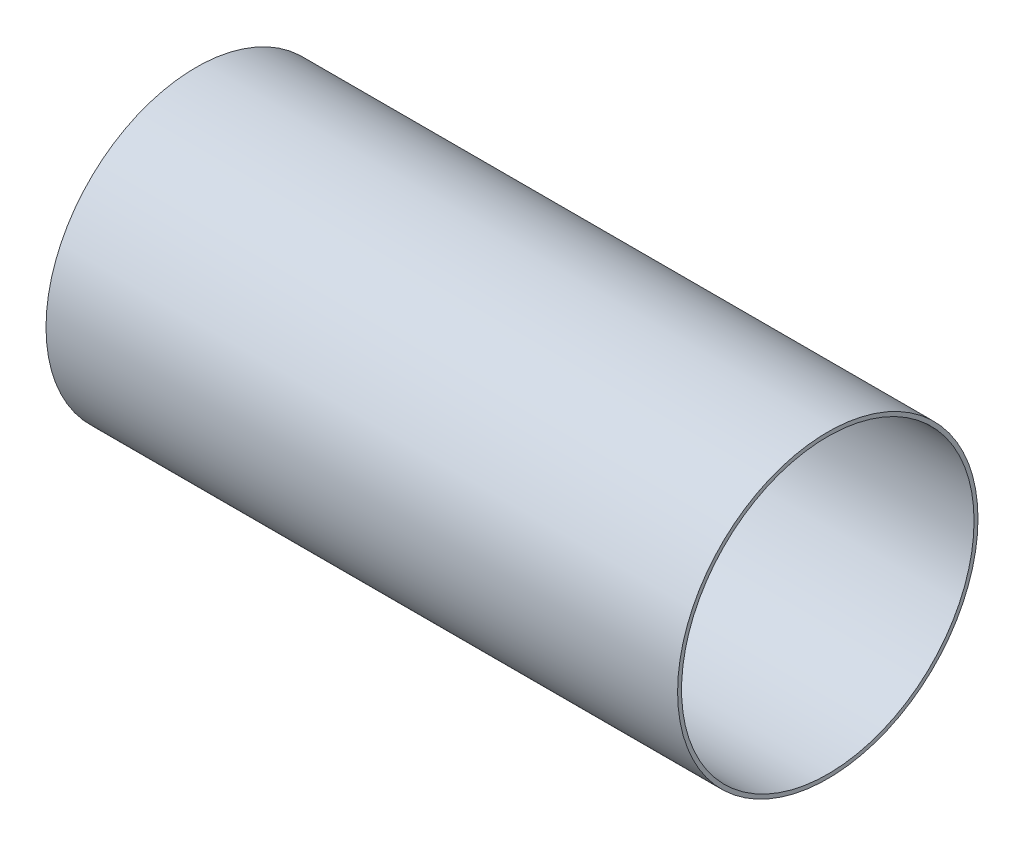
ISO-10303-21;
HEADER;
FILE_DESCRIPTION(('STEP AP214'),'2;1');
FILE_NAME('part.step','',(''),(''),'','','');
FILE_SCHEMA(('AUTOMOTIVE_DESIGN { 1 0 10303 214 1 1 1 1 }'));
ENDSEC;
DATA;
#1=APPLICATION_CONTEXT('core data for automotive mechanical design processes');
#2=APPLICATION_PROTOCOL_DEFINITION('international standard','automotive_design',2000,#1);
#3=PRODUCT_CONTEXT('',#1,'mechanical');
#4=PRODUCT('Part','Part','',(#3));
#5=PRODUCT_RELATED_PRODUCT_CATEGORY('part','',(#4));
#6=PRODUCT_DEFINITION_FORMATION('','',#4);
#7=PRODUCT_DEFINITION_CONTEXT('part definition',#1,'design');
#8=PRODUCT_DEFINITION('design','',#6,#7);
#9=PRODUCT_DEFINITION_SHAPE('','',#8);
#10=(LENGTH_UNIT() NAMED_UNIT(*) SI_UNIT(.MILLI.,.METRE.));
#11=(NAMED_UNIT(*) PLANE_ANGLE_UNIT() SI_UNIT($,.RADIAN.));
#12=(NAMED_UNIT(*) SI_UNIT($,.STERADIAN.) SOLID_ANGLE_UNIT());
#13=UNCERTAINTY_MEASURE_WITH_UNIT(LENGTH_MEASURE(1.E-05),#10,'distance_accuracy_value','');
#14=(GEOMETRIC_REPRESENTATION_CONTEXT(3) GLOBAL_UNCERTAINTY_ASSIGNED_CONTEXT((#13)) GLOBAL_UNIT_ASSIGNED_CONTEXT((#10,
#11,#12)) REPRESENTATION_CONTEXT('',''));
#15=CARTESIAN_POINT('',(0.,0.,0.));
#16=DIRECTION('',(0.,0.,1.));
#17=DIRECTION('',(1.,0.,0.));
#18=AXIS2_PLACEMENT_3D('',#15,#16,#17);
#19=CARTESIAN_POINT('',(320.,0.,0.));
#20=DIRECTION('',(1.,0.,0.));
#21=DIRECTION('',(0.,0.,-1.));
#22=AXIS2_PLACEMENT_3D('',#19,#20,#21);
#23=PLANE('',#22);
#24=CARTESIAN_POINT('',(320.,0.,0.));
#25=DIRECTION('',(1.,0.,0.));
#26=DIRECTION('',(0.,0.,-1.));
#27=AXIS2_PLACEMENT_3D('',#24,#25,#26);
#28=CIRCLE('',#27,76.1);
#29=CARTESIAN_POINT('',(320.,0.,-76.1));
#30=VERTEX_POINT('',#29);
#31=EDGE_CURVE('E10',#30,#30,#28,.T.);
#32=ORIENTED_EDGE('',*,*,#31,.T.);
#33=EDGE_LOOP('',(#32));
#34=FACE_BOUND('',#33,.T.);
#35=CARTESIAN_POINT('',(320.,0.,0.));
#36=DIRECTION('',(1.,0.,0.));
#37=DIRECTION('',(0.,0.,-1.));
#38=AXIS2_PLACEMENT_3D('',#35,#36,#37);
#39=CIRCLE('',#38,74.1);
#40=CARTESIAN_POINT('',(320.,0.,-74.1));
#41=VERTEX_POINT('',#40);
#42=EDGE_CURVE('E50',#41,#41,#39,.T.);
#43=ORIENTED_EDGE('',*,*,#42,.F.);
#44=EDGE_LOOP('',(#43));
#45=FACE_BOUND('',#44,.T.);
#46=ADVANCED_FACE('F37',(#34,#45),#23,.T.);
#47=CARTESIAN_POINT('',(0.,0.,0.));
#48=DIRECTION('',(1.,0.,0.));
#49=DIRECTION('',(0.,0.,-1.));
#50=AXIS2_PLACEMENT_3D('',#47,#48,#49);
#51=PLANE('',#50);
#52=CARTESIAN_POINT('',(0.,0.,0.));
#53=DIRECTION('',(1.,0.,0.));
#54=DIRECTION('',(0.,0.,-1.));
#55=AXIS2_PLACEMENT_3D('',#52,#53,#54);
#56=CIRCLE('',#55,76.1);
#57=CARTESIAN_POINT('',(0.,0.,-76.1));
#58=VERTEX_POINT('',#57);
#59=EDGE_CURVE('E41',#58,#58,#56,.T.);
#60=ORIENTED_EDGE('',*,*,#59,.F.);
#61=EDGE_LOOP('',(#60));
#62=FACE_BOUND('',#61,.T.);
#63=CARTESIAN_POINT('',(0.,0.,0.));
#64=DIRECTION('',(1.,0.,0.));
#65=DIRECTION('',(0.,0.,-1.));
#66=AXIS2_PLACEMENT_3D('',#63,#64,#65);
#67=CIRCLE('',#66,74.1);
#68=CARTESIAN_POINT('',(0.,0.,-74.1));
#69=VERTEX_POINT('',#68);
#70=EDGE_CURVE('E52',#69,#69,#67,.T.);
#71=ORIENTED_EDGE('',*,*,#70,.T.);
#72=EDGE_LOOP('',(#71));
#73=FACE_BOUND('',#72,.T.);
#74=ADVANCED_FACE('F64',(#62,#73),#51,.F.);
#75=CARTESIAN_POINT('',(320.,0.,0.));
#76=DIRECTION('',(-1.,0.,0.));
#77=DIRECTION('',(0.,0.,1.));
#78=AXIS2_PLACEMENT_3D('',#75,#76,#77);
#79=CYLINDRICAL_SURFACE('',#78,76.1);
#80=ORIENTED_EDGE('',*,*,#31,.F.);
#81=EDGE_LOOP('',(#80));
#82=FACE_BOUND('',#81,.T.);
#83=ORIENTED_EDGE('',*,*,#59,.T.);
#84=EDGE_LOOP('',(#83));
#85=FACE_BOUND('',#84,.T.);
#86=ADVANCED_FACE('F39',(#82,#85),#79,.T.);
#87=CARTESIAN_POINT('',(320.,0.,0.));
#88=DIRECTION('',(-1.,0.,0.));
#89=DIRECTION('',(0.,0.,1.));
#90=AXIS2_PLACEMENT_3D('',#87,#88,#89);
#91=CYLINDRICAL_SURFACE('',#90,74.1);
#92=ORIENTED_EDGE('',*,*,#42,.T.);
#93=EDGE_LOOP('',(#92));
#94=FACE_BOUND('',#93,.T.);
#95=ORIENTED_EDGE('',*,*,#70,.F.);
#96=EDGE_LOOP('',(#95));
#97=FACE_BOUND('',#96,.T.);
#98=ADVANCED_FACE('F60',(#94,#97),#91,.F.);
#99=CLOSED_SHELL('',(#46,#74,#86,#98));
#100=MANIFOLD_SOLID_BREP('B2',#99);
#101=ADVANCED_BREP_SHAPE_REPRESENTATION('',(#18,#100),#14);
#102=SHAPE_DEFINITION_REPRESENTATION(#9,#101);
ENDSEC;
END-ISO-10303-21;
